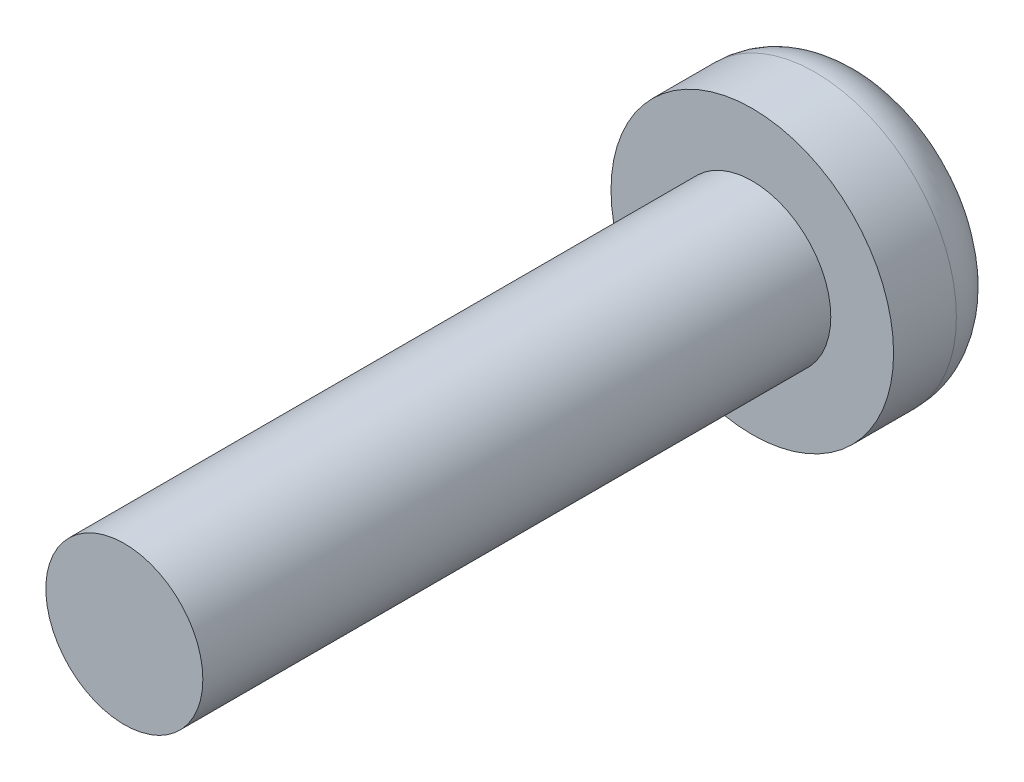
ISO-10303-21;
HEADER;
FILE_DESCRIPTION(('STEP AP214'),'2;1');
FILE_NAME('part.step','',(''),(''),'','','');
FILE_SCHEMA(('AUTOMOTIVE_DESIGN { 1 0 10303 214 1 1 1 1 }'));
ENDSEC;
DATA;
#1=APPLICATION_CONTEXT('core data for automotive mechanical design processes');
#2=APPLICATION_PROTOCOL_DEFINITION('international standard','automotive_design',2000,#1);
#3=PRODUCT_CONTEXT('',#1,'mechanical');
#4=PRODUCT('Part','Part','',(#3));
#5=PRODUCT_RELATED_PRODUCT_CATEGORY('part','',(#4));
#6=PRODUCT_DEFINITION_FORMATION('','',#4);
#7=PRODUCT_DEFINITION_CONTEXT('part definition',#1,'design');
#8=PRODUCT_DEFINITION('design','',#6,#7);
#9=PRODUCT_DEFINITION_SHAPE('','',#8);
#10=(LENGTH_UNIT() NAMED_UNIT(*) SI_UNIT(.MILLI.,.METRE.));
#11=(NAMED_UNIT(*) PLANE_ANGLE_UNIT() SI_UNIT($,.RADIAN.));
#12=(NAMED_UNIT(*) SI_UNIT($,.STERADIAN.) SOLID_ANGLE_UNIT());
#13=UNCERTAINTY_MEASURE_WITH_UNIT(LENGTH_MEASURE(1.E-05),#10,'distance_accuracy_value','');
#14=(GEOMETRIC_REPRESENTATION_CONTEXT(3) GLOBAL_UNCERTAINTY_ASSIGNED_CONTEXT((#13)) GLOBAL_UNIT_ASSIGNED_CONTEXT((#10,
#11,#12)) REPRESENTATION_CONTEXT('',''));
#15=CARTESIAN_POINT('',(0.,0.,0.));
#16=DIRECTION('',(0.,0.,1.));
#17=DIRECTION('',(1.,0.,0.));
#18=AXIS2_PLACEMENT_3D('',#15,#16,#17);
#19=CARTESIAN_POINT('',(0.,0.,12.));
#20=DIRECTION('',(0.,0.,-1.));
#21=DIRECTION('',(-1.,0.,0.));
#22=AXIS2_PLACEMENT_3D('',#19,#20,#21);
#23=CYLINDRICAL_SURFACE('',#22,1.5);
#24=CARTESIAN_POINT('',(0.,0.,12.));
#25=DIRECTION('',(0.,0.,1.));
#26=DIRECTION('',(1.,0.,0.));
#27=AXIS2_PLACEMENT_3D('',#24,#25,#26);
#28=CIRCLE('',#27,1.5);
#29=CARTESIAN_POINT('',(1.5,0.,12.));
#30=VERTEX_POINT('',#29);
#31=EDGE_CURVE('E50',#30,#30,#28,.T.);
#32=ORIENTED_EDGE('',*,*,#31,.F.);
#33=EDGE_LOOP('',(#32));
#34=FACE_BOUND('',#33,.T.);
#35=CARTESIAN_POINT('',(0.,0.,0.));
#36=DIRECTION('',(0.,0.,1.));
#37=DIRECTION('',(1.,0.,0.));
#38=AXIS2_PLACEMENT_3D('',#35,#36,#37);
#39=CIRCLE('',#38,1.5);
#40=CARTESIAN_POINT('',(1.5,0.,0.));
#41=VERTEX_POINT('',#40);
#42=EDGE_CURVE('E55',#41,#41,#39,.T.);
#43=ORIENTED_EDGE('',*,*,#42,.T.);
#44=EDGE_LOOP('',(#43));
#45=FACE_BOUND('',#44,.T.);
#46=ADVANCED_FACE('F37',(#34,#45),#23,.T.);
#47=CARTESIAN_POINT('',(0.,0.,12.));
#48=DIRECTION('',(0.,0.,1.));
#49=DIRECTION('',(1.,0.,0.));
#50=AXIS2_PLACEMENT_3D('',#47,#48,#49);
#51=PLANE('',#50);
#52=ORIENTED_EDGE('',*,*,#31,.T.);
#53=EDGE_LOOP('',(#52));
#54=FACE_BOUND('',#53,.T.);
#55=ADVANCED_FACE('F82',(#54),#51,.T.);
#56=CARTESIAN_POINT('',(0.,0.,-2.2));
#57=DIRECTION('',(0.,0.,1.));
#58=DIRECTION('',(1.,0.,0.));
#59=AXIS2_PLACEMENT_3D('',#56,#57,#58);
#60=CYLINDRICAL_SURFACE('',#59,2.7);
#61=CARTESIAN_POINT('',(0.,0.,-1.2));
#62=DIRECTION('',(0.,0.,-1.));
#63=DIRECTION('',(-1.,0.,0.));
#64=AXIS2_PLACEMENT_3D('',#61,#62,#63);
#65=CIRCLE('',#64,2.7);
#66=CARTESIAN_POINT('',(-2.7,0.,-1.2));
#67=VERTEX_POINT('',#66);
#68=EDGE_CURVE('E10',#67,#67,#65,.F.);
#69=ORIENTED_EDGE('',*,*,#68,.T.);
#70=EDGE_LOOP('',(#69));
#71=FACE_BOUND('',#70,.T.);
#72=CARTESIAN_POINT('',(0.,0.,0.));
#73=DIRECTION('',(0.,0.,-1.));
#74=DIRECTION('',(-1.,0.,0.));
#75=AXIS2_PLACEMENT_3D('',#72,#73,#74);
#76=CIRCLE('',#75,2.7);
#77=CARTESIAN_POINT('',(-2.7,0.,0.));
#78=VERTEX_POINT('',#77);
#79=EDGE_CURVE('E60',#78,#78,#76,.T.);
#80=ORIENTED_EDGE('',*,*,#79,.T.);
#81=EDGE_LOOP('',(#80));
#82=FACE_BOUND('',#81,.T.);
#83=ADVANCED_FACE('F66',(#71,#82),#60,.T.);
#84=CARTESIAN_POINT('',(0.,0.,-2.2));
#85=DIRECTION('',(0.,0.,-1.));
#86=DIRECTION('',(-1.,0.,0.));
#87=AXIS2_PLACEMENT_3D('',#84,#85,#86);
#88=PLANE('',#87);
#89=CARTESIAN_POINT('',(0.,0.,-2.2));
#90=DIRECTION('',(0.,0.,-1.));
#91=DIRECTION('',(-1.,0.,0.));
#92=AXIS2_PLACEMENT_3D('',#89,#90,#91);
#93=CIRCLE('',#92,1.7);
#94=CARTESIAN_POINT('',(-1.7,0.,-2.2));
#95=VERTEX_POINT('',#94);
#96=EDGE_CURVE('E45',#95,#95,#93,.T.);
#97=ORIENTED_EDGE('',*,*,#96,.T.);
#98=EDGE_LOOP('',(#97));
#99=FACE_BOUND('',#98,.T.);
#100=ADVANCED_FACE('F70',(#99),#88,.T.);
#101=CARTESIAN_POINT('',(0.,0.,0.));
#102=DIRECTION('',(0.,0.,-1.));
#103=DIRECTION('',(-1.,0.,0.));
#104=AXIS2_PLACEMENT_3D('',#101,#102,#103);
#105=PLANE('',#104);
#106=ORIENTED_EDGE('',*,*,#42,.F.);
#107=EDGE_LOOP('',(#106));
#108=FACE_BOUND('',#107,.T.);
#109=ORIENTED_EDGE('',*,*,#79,.F.);
#110=EDGE_LOOP('',(#109));
#111=FACE_BOUND('',#110,.T.);
#112=ADVANCED_FACE('F68',(#108,#111),#105,.F.);
#113=CARTESIAN_POINT('',(0.,0.,-1.2));
#114=DIRECTION('',(0.,0.,-1.));
#115=DIRECTION('',(-1.,0.,0.));
#116=AXIS2_PLACEMENT_3D('',#113,#114,#115);
#117=TOROIDAL_SURFACE('',#116,1.7,1.);
#118=ORIENTED_EDGE('',*,*,#68,.F.);
#119=EDGE_LOOP('',(#118));
#120=FACE_BOUND('',#119,.T.);
#121=ORIENTED_EDGE('',*,*,#96,.F.);
#122=EDGE_LOOP('',(#121));
#123=FACE_BOUND('',#122,.T.);
#124=ADVANCED_FACE('F39',(#120,#123),#117,.T.);
#125=CLOSED_SHELL('',(#46,#55,#83,#100,#112,#124));
#126=MANIFOLD_SOLID_BREP('B2',#125);
#127=ADVANCED_BREP_SHAPE_REPRESENTATION('',(#18,#126),#14);
#128=SHAPE_DEFINITION_REPRESENTATION(#9,#127);
ENDSEC;
END-ISO-10303-21;
